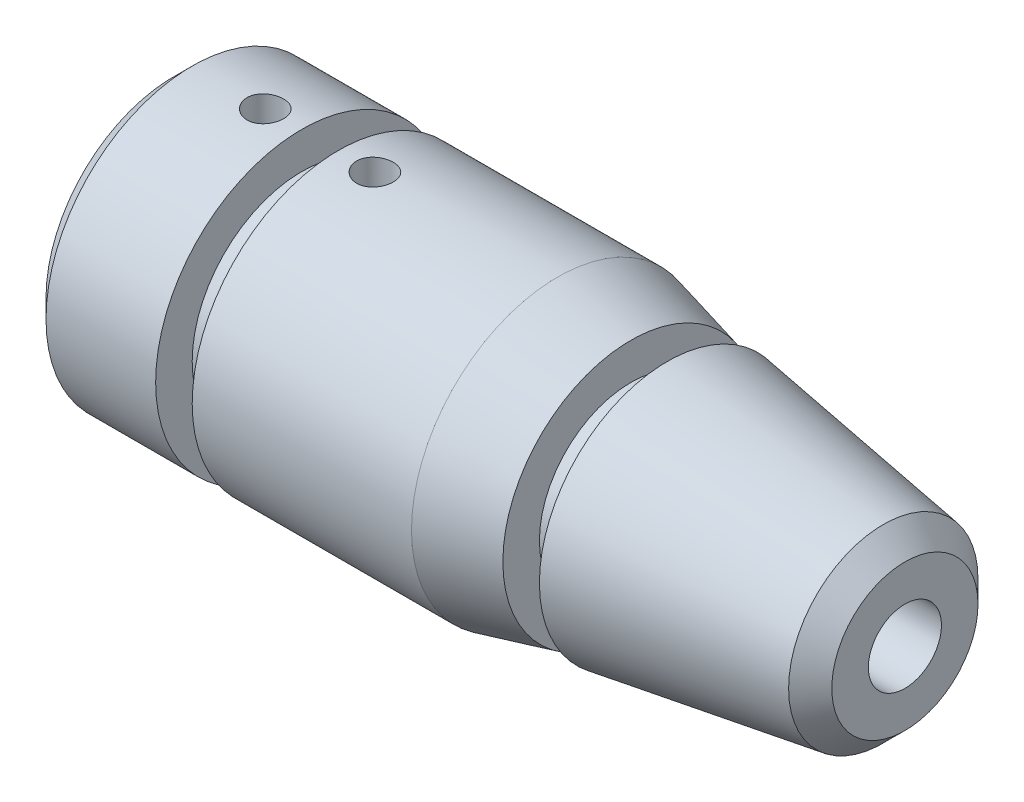
ISO-10303-21;
HEADER;
FILE_DESCRIPTION(('STEP AP214'),'2;1');
FILE_NAME('part.step','',(''),(''),'','','');
FILE_SCHEMA(('AUTOMOTIVE_DESIGN { 1 0 10303 214 1 1 1 1 }'));
ENDSEC;
DATA;
#1=APPLICATION_CONTEXT('core data for automotive mechanical design processes');
#2=APPLICATION_PROTOCOL_DEFINITION('international standard','automotive_design',2000,#1);
#3=PRODUCT_CONTEXT('',#1,'mechanical');
#4=PRODUCT('Part','Part','',(#3));
#5=PRODUCT_RELATED_PRODUCT_CATEGORY('part','',(#4));
#6=PRODUCT_DEFINITION_FORMATION('','',#4);
#7=PRODUCT_DEFINITION_CONTEXT('part definition',#1,'design');
#8=PRODUCT_DEFINITION('design','',#6,#7);
#9=PRODUCT_DEFINITION_SHAPE('','',#8);
#10=(LENGTH_UNIT() NAMED_UNIT(*) SI_UNIT(.MILLI.,.METRE.));
#11=(NAMED_UNIT(*) PLANE_ANGLE_UNIT() SI_UNIT($,.RADIAN.));
#12=(NAMED_UNIT(*) SI_UNIT($,.STERADIAN.) SOLID_ANGLE_UNIT());
#13=UNCERTAINTY_MEASURE_WITH_UNIT(LENGTH_MEASURE(1.E-05),#10,'distance_accuracy_value','');
#14=(GEOMETRIC_REPRESENTATION_CONTEXT(3) GLOBAL_UNCERTAINTY_ASSIGNED_CONTEXT((#13)) GLOBAL_UNIT_ASSIGNED_CONTEXT((#10,
#11,#12)) REPRESENTATION_CONTEXT('',''));
#15=CARTESIAN_POINT('',(0.,0.,0.));
#16=DIRECTION('',(0.,0.,1.));
#17=DIRECTION('',(1.,0.,0.));
#18=AXIS2_PLACEMENT_3D('',#15,#16,#17);
#19=CARTESIAN_POINT('',(0.,0.,0.));
#20=DIRECTION('',(-1.,0.,0.));
#21=DIRECTION('',(0.,0.,1.));
#22=AXIS2_PLACEMENT_3D('',#19,#20,#21);
#23=PLANE('',#22);
#24=CARTESIAN_POINT('',(0.,0.,0.));
#25=DIRECTION('',(-1.,0.,0.));
#26=DIRECTION('',(0.,0.,1.));
#27=AXIS2_PLACEMENT_3D('',#24,#25,#26);
#28=CIRCLE('',#27,11.1125);
#29=CARTESIAN_POINT('',(0.,0.,11.1125));
#30=VERTEX_POINT('',#29);
#31=EDGE_CURVE('E62',#30,#30,#28,.T.);
#32=ORIENTED_EDGE('',*,*,#31,.T.);
#33=EDGE_LOOP('',(#32));
#34=FACE_BOUND('',#33,.T.);
#35=CARTESIAN_POINT('',(0.,0.,0.));
#36=DIRECTION('',(-1.,0.,0.));
#37=DIRECTION('',(0.,0.,1.));
#38=AXIS2_PLACEMENT_3D('',#35,#36,#37);
#39=CIRCLE('',#38,6.35);
#40=CARTESIAN_POINT('',(0.,0.,6.35));
#41=VERTEX_POINT('',#40);
#42=EDGE_CURVE('E68',#41,#41,#39,.T.);
#43=ORIENTED_EDGE('',*,*,#42,.F.);
#44=EDGE_LOOP('',(#43));
#45=FACE_BOUND('',#44,.T.);
#46=ADVANCED_FACE('F43',(#34,#45),#23,.T.);
#47=CARTESIAN_POINT('',(0.,0.,0.));
#48=DIRECTION('',(-1.,0.,0.));
#49=DIRECTION('',(0.,0.,1.));
#50=AXIS2_PLACEMENT_3D('',#47,#48,#49);
#51=CYLINDRICAL_SURFACE('',#50,6.35);
#52=CARTESIAN_POINT('',(7.9375,6.14836106210428,1.5875));
#53=CARTESIAN_POINT('',(8.02516222683713,6.14836273554171,1.58749750990578));
#54=CARTESIAN_POINT('',(8.11285201066053,6.15025634318835,1.58021416589079));
#55=CARTESIAN_POINT('',(8.28571341214051,6.15760682365713,1.55131968466973));
#56=CARTESIAN_POINT('',(8.37088353408739,6.16306577024852,1.5297002087813));
#57=CARTESIAN_POINT('',(8.53618024674877,6.17689090118439,1.47287691176629));
#58=CARTESIAN_POINT('',(8.6163131936699,6.1852533310841,1.43769062718759));
#59=CARTESIAN_POINT('',(8.76954739136285,6.20393851938293,1.354785924701));
#60=CARTESIAN_POINT('',(8.84264834342094,6.21426136100349,1.30706697473604));
#61=CARTESIAN_POINT('',(8.9813521447415,6.23595854885813,1.19932985134304));
#62=CARTESIAN_POINT('',(9.04677743622228,6.24734969490624,1.13908642369207));
#63=CARTESIAN_POINT('',(9.16670848541882,6.26975425952214,1.00849561070392));
#64=CARTESIAN_POINT('',(9.22121322226981,6.28076764269657,0.938147281804496));
#65=CARTESIAN_POINT('',(9.31848242194586,6.30136163855569,0.788127202685138));
#66=CARTESIAN_POINT('',(9.36107245648253,6.31092011499376,0.708339055883904));
#67=CARTESIAN_POINT('',(9.43216912403721,6.32733565573,0.542457122025907));
#68=CARTESIAN_POINT('',(9.46067783496635,6.33419311857309,0.456364267477885));
#69=CARTESIAN_POINT('',(9.5022338749574,6.34431521868594,0.282167811808895));
#70=CARTESIAN_POINT('',(9.51558272414738,6.34764982591139,0.194140276913602));
#71=CARTESIAN_POINT('',(9.52738657083998,6.35059432258134,0.0170363002318606));
#72=CARTESIAN_POINT('',(9.5258437703531,6.35020476271407,-0.0720399845316717));
#73=CARTESIAN_POINT('',(9.50812497009116,6.34579690295495,-0.246621692386163));
#74=CARTESIAN_POINT('',(9.4922744335908,6.34185931486455,-0.332162492266692));
#75=CARTESIAN_POINT('',(9.44691324351921,6.33089181193282,-0.499329467769226));
#76=CARTESIAN_POINT('',(9.41740186278535,6.3238617324801,-0.580955434750569));
#77=CARTESIAN_POINT('',(9.34529336761372,6.30737568660069,-0.738833141809117));
#78=CARTESIAN_POINT('',(9.30258042663979,6.29789837506359,-0.815029659254324));
#79=CARTESIAN_POINT('',(9.20536914376118,6.27754588919127,-0.959287550465525));
#80=CARTESIAN_POINT('',(9.15086875146401,6.26667047179331,-1.02734750569824));
#81=CARTESIAN_POINT('',(9.02988494884119,6.24435958243646,-1.15534128069737));
#82=CARTESIAN_POINT('',(8.96311714335917,6.23291691898958,-1.21500531553188));
#83=CARTESIAN_POINT('',(8.82040401680194,6.21103052633109,-1.32234999684129));
#84=CARTESIAN_POINT('',(8.74445826702322,6.20058684382292,-1.37003008322305));
#85=CARTESIAN_POINT('',(8.58501582831541,6.18185515488097,-1.45222615482337));
#86=CARTESIAN_POINT('',(8.50148431125112,6.17357784665833,-1.48667718756565));
#87=CARTESIAN_POINT('',(8.32955822777145,6.16025336488873,-1.54096342276019));
#88=CARTESIAN_POINT('',(8.24116470637071,6.15520550014489,-1.56080175290274));
#89=CARTESIAN_POINT('',(8.06452571653282,6.14905651084854,-1.58485182055239));
#90=CARTESIAN_POINT('',(7.97633800123569,6.14785466574467,-1.58946245093896));
#91=CARTESIAN_POINT('',(7.80045307027287,6.1492596311046,-1.58401828897737));
#92=CARTESIAN_POINT('',(7.71275581020096,6.15186609096804,-1.57396484663399));
#93=CARTESIAN_POINT('',(7.54182244175376,6.16049747041146,-1.53982766960042));
#94=CARTESIAN_POINT('',(7.45853681862752,6.16646576098828,-1.51597618335891));
#95=CARTESIAN_POINT('',(7.29714602426418,6.18109456102061,-1.45517748186084));
#96=CARTESIAN_POINT('',(7.21904146799986,6.1897553893787,-1.41822871529747));
#97=CARTESIAN_POINT('',(7.06853978855423,6.20900547054222,-1.33144937413972));
#98=CARTESIAN_POINT('',(6.99628468657263,6.21962922065218,-1.28138031368563));
#99=CARTESIAN_POINT('',(6.86105538962114,6.2415234775054,-1.17008321503345));
#100=CARTESIAN_POINT('',(6.7980827229272,6.25279409032579,-1.10885334300364));
#101=CARTESIAN_POINT('',(6.68158998796744,6.2750535092507,-0.975142069563254));
#102=CARTESIAN_POINT('',(6.6283458602815,6.28602820809266,-0.902417474643905));
#103=CARTESIAN_POINT('',(6.53482572448596,6.30616732549721,-0.748828008777799));
#104=CARTESIAN_POINT('',(6.49454903995379,6.31533183847515,-0.667963562720178));
#105=CARTESIAN_POINT('',(6.42845676807476,6.3307602349383,-0.500948645248108));
#106=CARTESIAN_POINT('',(6.4025371794193,6.3370449206423,-0.414841342381764));
#107=CARTESIAN_POINT('',(6.36558268752365,6.34609661306326,-0.23931524450611));
#108=CARTESIAN_POINT('',(6.3545449117007,6.34886429864815,-0.149897092002977));
#109=CARTESIAN_POINT('',(6.34782895154884,6.35054243936488,0.027120098228778));
#110=CARTESIAN_POINT('',(6.35174353681107,6.34955516472013,0.114702950308575));
#111=CARTESIAN_POINT('',(6.37388842582975,6.3440611062616,0.287920900558397));
#112=CARTESIAN_POINT('',(6.3921183038333,6.33955442711888,0.373556056577155));
#113=CARTESIAN_POINT('',(6.44215789888635,6.32754374655666,0.540021519086144));
#114=CARTESIAN_POINT('',(6.47389398213696,6.32005601147983,0.620875210147366));
#115=CARTESIAN_POINT('',(6.54997829419318,6.30287171149998,0.776155821703329));
#116=CARTESIAN_POINT('',(6.59432811286293,6.29317486818656,0.850581930508267));
#117=CARTESIAN_POINT('',(6.69562293397035,6.27232758869116,0.992825561372939));
#118=CARTESIAN_POINT('',(6.75284422686546,6.26114789401158,1.06044204392718));
#119=CARTESIAN_POINT('',(6.8777212775084,6.23872655372022,1.18525134468062));
#120=CARTESIAN_POINT('',(6.94537967680542,6.22748489312182,1.24244151604575));
#121=CARTESIAN_POINT('',(7.09072974504461,6.2059736792862,1.34582221703577));
#122=CARTESIAN_POINT('',(7.16858504591754,6.19572617421192,1.3917876333714));
#123=CARTESIAN_POINT('',(7.33116309025228,6.17766029436602,1.46990894837737));
#124=CARTESIAN_POINT('',(7.41588078369445,6.16984015341641,1.50207489424355));
#125=CARTESIAN_POINT('',(7.57329100627491,6.15873655124406,1.54689576409763));
#126=CARTESIAN_POINT('',(7.64523039845938,6.15487502513368,1.56208915832016));
#127=CARTESIAN_POINT('',(7.79060682953744,6.14968668754596,1.58239188946006));
#128=CARTESIAN_POINT('',(7.86404374013903,6.14835965985317,1.58750208656584));
#129=CARTESIAN_POINT('',(7.9375,6.14836106210428,1.5875));
#130=B_SPLINE_CURVE_WITH_KNOTS('',3,(#52,#53,#54,#55,#56,#57,#58,#59,#60,#61,#62,#63,#64,#65,
#66,#67,#68,#69,#70,#71,#72,#73,#74,#75,#76,#77,#78,#79,#80,#81,#82,#83,#84,#85,#86,#87,#88,#89,
#90,#91,#92,#93,#94,#95,#96,#97,#98,#99,#100,#101,#102,#103,#104,#105,#106,#107,#108,#109,#110,
#111,#112,#113,#114,#115,#116,#117,#118,#119,#120,#121,#122,#123,#124,#125,#126,#127,#128,#129),
.UNSPECIFIED.,.T.,.F.,(4,2,2,2,2,2,2,2,2,2,2,2,2,2,2,2,2,2,2,2,2,2,2,2,2,2,2,2,2,2,2,2,2,2,2,2,
2,2,4),(0.,0.262716925502447,0.525586795807202,0.788118011750423,1.05066037489729,
1.3184121091254,1.58618886139715,1.85770200212679,2.12917506502903,2.39514856882045,
2.66108274402923,2.92111596807481,3.18116303520239,3.44355975151572,3.7060021477276,
3.97554746273164,4.24510537311874,4.51597034325336,4.78677732082263,5.0504316997369,
5.31406180761714,5.57337852180846,5.832725961026,6.09716107120565,6.36163966992003,
6.63273585162977,6.90381788981916,7.172909662324,7.44194948557239,7.70371488290935,
7.96547249534383,8.22582096615416,8.48620226643676,8.75282156329615,9.01950845044098,
9.2911706307577,9.56263468067804,9.78279620257604,10.002938941882),.UNSPECIFIED.);
#131=CARTESIAN_POINT('',(7.9375,6.14836106210428,1.5875));
#132=VERTEX_POINT('',#131);
#133=EDGE_CURVE('E120',#132,#132,#130,.T.);
#134=ORIENTED_EDGE('',*,*,#133,.T.);
#135=EDGE_LOOP('',(#134));
#136=FACE_BOUND('',#135,.T.);
#137=CARTESIAN_POINT('',(17.4625,6.14836106210428,1.5875));
#138=CARTESIAN_POINT('',(17.5501622268371,6.14836273554171,1.58749750990578));
#139=CARTESIAN_POINT('',(17.6378520106605,6.15025634318835,1.58021416589079));
#140=CARTESIAN_POINT('',(17.8107134121405,6.15760682365713,1.55131968466973));
#141=CARTESIAN_POINT('',(17.8958835340874,6.16306577024852,1.52970020878129));
#142=CARTESIAN_POINT('',(18.0611802467488,6.17689090118439,1.47287691176629));
#143=CARTESIAN_POINT('',(18.1413131936699,6.1852533310841,1.43769062718759));
#144=CARTESIAN_POINT('',(18.2945473913628,6.20393851938293,1.354785924701));
#145=CARTESIAN_POINT('',(18.3676483434209,6.21426136100349,1.30706697473604));
#146=CARTESIAN_POINT('',(18.5063521447415,6.23595854885813,1.19932985134304));
#147=CARTESIAN_POINT('',(18.5717774362223,6.24734969490624,1.13908642369207));
#148=CARTESIAN_POINT('',(18.6917084854188,6.26975425952214,1.00849561070392));
#149=CARTESIAN_POINT('',(18.7462132222698,6.28076764269657,0.938147281804495));
#150=CARTESIAN_POINT('',(18.8434824219459,6.30136163855569,0.788127202685135));
#151=CARTESIAN_POINT('',(18.8860724564825,6.31092011499376,0.708339055883901));
#152=CARTESIAN_POINT('',(18.9571691240372,6.32733565573,0.542457122025904));
#153=CARTESIAN_POINT('',(18.9856778349663,6.33419311857309,0.456364267477882));
#154=CARTESIAN_POINT('',(19.0272338749574,6.34431521868594,0.282167811808892));
#155=CARTESIAN_POINT('',(19.0405827241474,6.34764982591139,0.194140276913599));
#156=CARTESIAN_POINT('',(19.05238657084,6.35059432258134,0.017036300231859));
#157=CARTESIAN_POINT('',(19.0508437703531,6.35020476271407,-0.0720399845316728));
#158=CARTESIAN_POINT('',(19.0331249700912,6.34579690295495,-0.246621692386164));
#159=CARTESIAN_POINT('',(19.0172744335908,6.34185931486455,-0.332162492266693));
#160=CARTESIAN_POINT('',(18.9719132435192,6.33089181193282,-0.499329467769226));
#161=CARTESIAN_POINT('',(18.9424018627853,6.3238617324801,-0.58095543475057));
#162=CARTESIAN_POINT('',(18.8702933676137,6.30737568660069,-0.738833141809117));
#163=CARTESIAN_POINT('',(18.8275804266398,6.29789837506359,-0.815029659254324));
#164=CARTESIAN_POINT('',(18.7303691437612,6.27754588919127,-0.959287550465524));
#165=CARTESIAN_POINT('',(18.675868751464,6.26667047179331,-1.02734750569824));
#166=CARTESIAN_POINT('',(18.5548849488412,6.24435958243646,-1.15534128069736));
#167=CARTESIAN_POINT('',(18.4881171433592,6.23291691898958,-1.21500531553187));
#168=CARTESIAN_POINT('',(18.3454040168019,6.21103052633109,-1.32234999684129));
#169=CARTESIAN_POINT('',(18.2694582670232,6.20058684382292,-1.37003008322305));
#170=CARTESIAN_POINT('',(18.1100158283154,6.18185515488097,-1.45222615482337));
#171=CARTESIAN_POINT('',(18.0264843112511,6.17357784665833,-1.48667718756565));
#172=CARTESIAN_POINT('',(17.8545582277715,6.16025336488873,-1.54096342276019));
#173=CARTESIAN_POINT('',(17.7661647063707,6.15520550014489,-1.56080175290274));
#174=CARTESIAN_POINT('',(17.5895257165328,6.14905651084854,-1.58485182055239));
#175=CARTESIAN_POINT('',(17.5013380012357,6.14785466574467,-1.58946245093896));
#176=CARTESIAN_POINT('',(17.3254530702729,6.1492596311046,-1.58401828897737));
#177=CARTESIAN_POINT('',(17.237755810201,6.15186609096804,-1.57396484663399));
#178=CARTESIAN_POINT('',(17.0668224417538,6.16049747041146,-1.53982766960041));
#179=CARTESIAN_POINT('',(16.9835368186275,6.16646576098828,-1.51597618335891));
#180=CARTESIAN_POINT('',(16.8221460242642,6.18109456102061,-1.45517748186084));
#181=CARTESIAN_POINT('',(16.7440414679999,6.1897553893787,-1.41822871529747));
#182=CARTESIAN_POINT('',(16.5935397885542,6.20900547054222,-1.33144937413971));
#183=CARTESIAN_POINT('',(16.5212846865726,6.21962922065218,-1.28138031368562));
#184=CARTESIAN_POINT('',(16.3860553896211,6.2415234775054,-1.17008321503345));
#185=CARTESIAN_POINT('',(16.3230827229272,6.25279409032579,-1.10885334300363));
#186=CARTESIAN_POINT('',(16.2065899879674,6.2750535092507,-0.975142069563251));
#187=CARTESIAN_POINT('',(16.1533458602815,6.28602820809266,-0.902417474643903));
#188=CARTESIAN_POINT('',(16.059825724486,6.30616732549721,-0.748828008777798));
#189=CARTESIAN_POINT('',(16.0195490399538,6.31533183847515,-0.667963562720177));
#190=CARTESIAN_POINT('',(15.9534567680748,6.3307602349383,-0.500948645248107));
#191=CARTESIAN_POINT('',(15.9275371794193,6.3370449206423,-0.414841342381763));
#192=CARTESIAN_POINT('',(15.8905826875237,6.34609661306326,-0.239315244506109));
#193=CARTESIAN_POINT('',(15.8795449117007,6.34886429864815,-0.149897092002975));
#194=CARTESIAN_POINT('',(15.8728289515488,6.35054243936488,0.0271200982287798));
#195=CARTESIAN_POINT('',(15.8767435368111,6.34955516472013,0.114702950308576));
#196=CARTESIAN_POINT('',(15.8988884258298,6.3440611062616,0.287920900558397));
#197=CARTESIAN_POINT('',(15.9171183038333,6.33955442711888,0.373556056577156));
#198=CARTESIAN_POINT('',(15.9671578988863,6.32754374655666,0.540021519086144));
#199=CARTESIAN_POINT('',(15.998893982137,6.32005601147983,0.620875210147365));
#200=CARTESIAN_POINT('',(16.0749782941932,6.30287171149998,0.776155821703329));
#201=CARTESIAN_POINT('',(16.1193281128629,6.29317486818656,0.850581930508267));
#202=CARTESIAN_POINT('',(16.2206229339704,6.27232758869116,0.992825561372938));
#203=CARTESIAN_POINT('',(16.2778442268655,6.26114789401158,1.06044204392718));
#204=CARTESIAN_POINT('',(16.4027212775084,6.23872655372022,1.18525134468062));
#205=CARTESIAN_POINT('',(16.4703796768054,6.22748489312182,1.24244151604575));
#206=CARTESIAN_POINT('',(16.6157297450446,6.2059736792862,1.34582221703577));
#207=CARTESIAN_POINT('',(16.6935850459175,6.19572617421192,1.39178763337139));
#208=CARTESIAN_POINT('',(16.8561630902523,6.17766029436603,1.46990894837737));
#209=CARTESIAN_POINT('',(16.9408807836944,6.16984015341641,1.50207489424355));
#210=CARTESIAN_POINT('',(17.0982910062749,6.15873655124406,1.54689576409763));
#211=CARTESIAN_POINT('',(17.1702303984594,6.15487502513368,1.56208915832016));
#212=CARTESIAN_POINT('',(17.3156068295374,6.14968668754596,1.58239188946006));
#213=CARTESIAN_POINT('',(17.389043740139,6.14835965985317,1.58750208656584));
#214=CARTESIAN_POINT('',(17.4625,6.14836106210428,1.5875));
#215=B_SPLINE_CURVE_WITH_KNOTS('',3,(#137,#138,#139,#140,#141,#142,#143,#144,#145,#146,#147,
#148,#149,#150,#151,#152,#153,#154,#155,#156,#157,#158,#159,#160,#161,#162,#163,#164,#165,#166,
#167,#168,#169,#170,#171,#172,#173,#174,#175,#176,#177,#178,#179,#180,#181,#182,#183,#184,#185,
#186,#187,#188,#189,#190,#191,#192,#193,#194,#195,#196,#197,#198,#199,#200,#201,#202,#203,#204,
#205,#206,#207,#208,#209,#210,#211,#212,#213,#214),.UNSPECIFIED.,.T.,.F.,(4,2,2,2,2,2,2,2,2,2,2,
2,2,2,2,2,2,2,2,2,2,2,2,2,2,2,2,2,2,2,2,2,2,2,2,2,2,2,4),(0.,0.262716925502447,
0.525586795807202,0.788118011750419,1.05066037489729,1.3184121091254,1.58618886139715,
1.85770200212679,2.12917506502903,2.39514856882045,2.66108274402923,2.92111596807481,
3.18116303520239,3.44355975151572,3.70600214772759,3.97554746273163,4.24510537311874,
4.51597034325335,4.78677732082262,5.0504316997369,5.31406180761714,5.57337852180846,
5.832725961026,6.09716107120564,6.36163966992003,6.63273585162977,6.90381788981916,
7.17290966232399,7.44194948557239,7.70371488290934,7.96547249534382,8.22582096615415,
8.48620226643675,8.75282156329614,9.01950845044097,9.29117063075769,9.56263468067803,
9.78279620257604,10.0029389418819),.UNSPECIFIED.);
#216=CARTESIAN_POINT('',(17.4625,6.14836106210428,1.5875));
#217=VERTEX_POINT('',#216);
#218=EDGE_CURVE('E131',#217,#217,#215,.T.);
#219=ORIENTED_EDGE('',*,*,#218,.T.);
#220=EDGE_LOOP('',(#219));
#221=FACE_BOUND('',#220,.T.);
#222=ORIENTED_EDGE('',*,*,#42,.T.);
#223=EDGE_LOOP('',(#222));
#224=FACE_BOUND('',#223,.T.);
#225=CARTESIAN_POINT('',(20.6375,0.,0.));
#226=DIRECTION('',(-1.,0.,0.));
#227=DIRECTION('',(0.,0.,1.));
#228=AXIS2_PLACEMENT_3D('',#225,#226,#227);
#229=CIRCLE('',#228,6.35);
#230=CARTESIAN_POINT('',(20.6375,0.,6.35));
#231=VERTEX_POINT('',#230);
#232=EDGE_CURVE('E72',#231,#231,#229,.T.);
#233=ORIENTED_EDGE('',*,*,#232,.F.);
#234=EDGE_LOOP('',(#233));
#235=FACE_BOUND('',#234,.T.);
#236=ADVANCED_FACE('F193',(#136,#221,#224,#235),#51,.F.);
#237=CARTESIAN_POINT('',(25.4,0.,0.));
#238=DIRECTION('',(-1.,0.,0.));
#239=DIRECTION('',(0.,0.,1.));
#240=AXIS2_PLACEMENT_3D('',#237,#238,#239);
#241=CONICAL_SURFACE('',#240,3.17499999999999,0.588002603547569);
#242=ORIENTED_EDGE('',*,*,#232,.T.);
#243=EDGE_LOOP('',(#242));
#244=FACE_BOUND('',#243,.T.);
#245=CARTESIAN_POINT('',(25.4,0.,0.));
#246=DIRECTION('',(-1.,0.,0.));
#247=DIRECTION('',(0.,0.,1.));
#248=AXIS2_PLACEMENT_3D('',#245,#246,#247);
#249=CIRCLE('',#248,3.17499999999999);
#250=CARTESIAN_POINT('',(25.4,0.,3.17499999999999));
#251=VERTEX_POINT('',#250);
#252=EDGE_CURVE('E76',#251,#251,#249,.T.);
#253=ORIENTED_EDGE('',*,*,#252,.F.);
#254=EDGE_LOOP('',(#253));
#255=FACE_BOUND('',#254,.T.);
#256=ADVANCED_FACE('F189',(#244,#255),#241,.F.);
#257=CARTESIAN_POINT('',(0.,0.,0.));
#258=DIRECTION('',(-1.,0.,0.));
#259=DIRECTION('',(0.,0.,1.));
#260=AXIS2_PLACEMENT_3D('',#257,#258,#259);
#261=CYLINDRICAL_SURFACE('',#260,3.17499999999999);
#262=ORIENTED_EDGE('',*,*,#252,.T.);
#263=EDGE_LOOP('',(#262));
#264=FACE_BOUND('',#263,.T.);
#265=CARTESIAN_POINT('',(63.5,0.,0.));
#266=DIRECTION('',(-1.,0.,0.));
#267=DIRECTION('',(0.,0.,1.));
#268=AXIS2_PLACEMENT_3D('',#265,#266,#267);
#269=CIRCLE('',#268,3.175);
#270=CARTESIAN_POINT('',(63.5,0.,3.175));
#271=VERTEX_POINT('',#270);
#272=EDGE_CURVE('E80',#271,#271,#269,.T.);
#273=ORIENTED_EDGE('',*,*,#272,.F.);
#274=EDGE_LOOP('',(#273));
#275=FACE_BOUND('',#274,.T.);
#276=ADVANCED_FACE('F186',(#264,#275),#261,.F.);
#277=CARTESIAN_POINT('',(63.5,0.,0.));
#278=DIRECTION('',(1.,0.,0.));
#279=DIRECTION('',(0.,0.,-1.));
#280=AXIS2_PLACEMENT_3D('',#277,#278,#279);
#281=PLANE('',#280);
#282=CARTESIAN_POINT('',(63.5,0.,0.));
#283=DIRECTION('',(1.,0.,0.));
#284=DIRECTION('',(0.,0.,-1.));
#285=AXIS2_PLACEMENT_3D('',#282,#283,#284);
#286=CIRCLE('',#285,6.35000000000003);
#287=CARTESIAN_POINT('',(63.5,0.,-6.35000000000003));
#288=VERTEX_POINT('',#287);
#289=EDGE_CURVE('E10',#288,#288,#286,.T.);
#290=ORIENTED_EDGE('',*,*,#289,.T.);
#291=EDGE_LOOP('',(#290));
#292=FACE_BOUND('',#291,.T.);
#293=ORIENTED_EDGE('',*,*,#272,.T.);
#294=EDGE_LOOP('',(#293));
#295=FACE_BOUND('',#294,.T.);
#296=ADVANCED_FACE('F183',(#292,#295),#281,.T.);
#297=CARTESIAN_POINT('',(42.8625,0.,0.));
#298=DIRECTION('',(-1.,0.,0.));
#299=DIRECTION('',(0.,0.,1.));
#300=AXIS2_PLACEMENT_3D('',#297,#298,#299);
#301=CONICAL_SURFACE('',#300,11.1125,0.152649328395265);
#302=CARTESIAN_POINT('',(61.6238636363637,0.,0.));
#303=DIRECTION('',(1.,0.,0.));
#304=DIRECTION('',(0.,0.,-1.));
#305=AXIS2_PLACEMENT_3D('',#302,#303,#304);
#306=CIRCLE('',#305,8.22613636363636);
#307=CARTESIAN_POINT('',(61.6238636363637,0.,-8.22613636363636));
#308=VERTEX_POINT('',#307);
#309=EDGE_CURVE('E52',#308,#308,#306,.F.);
#310=ORIENTED_EDGE('',*,*,#309,.T.);
#311=EDGE_LOOP('',(#310));
#312=FACE_BOUND('',#311,.T.);
#313=CARTESIAN_POINT('',(42.8625,0.,0.));
#314=DIRECTION('',(-1.,0.,0.));
#315=DIRECTION('',(0.,0.,1.));
#316=AXIS2_PLACEMENT_3D('',#313,#314,#315);
#317=CIRCLE('',#316,11.1125);
#318=CARTESIAN_POINT('',(42.8625,0.,11.1125));
#319=VERTEX_POINT('',#318);
#320=EDGE_CURVE('E84',#319,#319,#317,.T.);
#321=ORIENTED_EDGE('',*,*,#320,.F.);
#322=EDGE_LOOP('',(#321));
#323=FACE_BOUND('',#322,.T.);
#324=ADVANCED_FACE('F179',(#312,#323),#301,.T.);
#325=CARTESIAN_POINT('',(42.8625,0.,0.));
#326=DIRECTION('',(-1.,0.,0.));
#327=DIRECTION('',(0.,0.,1.));
#328=AXIS2_PLACEMENT_3D('',#325,#326,#327);
#329=PLANE('',#328);
#330=ORIENTED_EDGE('',*,*,#320,.T.);
#331=EDGE_LOOP('',(#330));
#332=FACE_BOUND('',#331,.T.);
#333=CARTESIAN_POINT('',(42.8625,0.,0.));
#334=DIRECTION('',(-1.,0.,0.));
#335=DIRECTION('',(0.,0.,1.));
#336=AXIS2_PLACEMENT_3D('',#333,#334,#335);
#337=CIRCLE('',#336,7.93750000000001);
#338=CARTESIAN_POINT('',(42.8625,0.,7.93750000000001));
#339=VERTEX_POINT('',#338);
#340=EDGE_CURVE('E88',#339,#339,#337,.T.);
#341=ORIENTED_EDGE('',*,*,#340,.F.);
#342=EDGE_LOOP('',(#341));
#343=FACE_BOUND('',#342,.T.);
#344=ADVANCED_FACE('F175',(#332,#343),#329,.T.);
#345=CARTESIAN_POINT('',(0.,0.,0.));
#346=DIRECTION('',(-1.,0.,0.));
#347=DIRECTION('',(0.,0.,1.));
#348=AXIS2_PLACEMENT_3D('',#345,#346,#347);
#349=CYLINDRICAL_SURFACE('',#348,7.9375);
#350=ORIENTED_EDGE('',*,*,#340,.T.);
#351=EDGE_LOOP('',(#350));
#352=FACE_BOUND('',#351,.T.);
#353=CARTESIAN_POINT('',(39.6875,0.,0.));
#354=DIRECTION('',(-1.,0.,0.));
#355=DIRECTION('',(0.,0.,1.));
#356=AXIS2_PLACEMENT_3D('',#353,#354,#355);
#357=CIRCLE('',#356,7.9375);
#358=CARTESIAN_POINT('',(39.6875,0.,7.9375));
#359=VERTEX_POINT('',#358);
#360=EDGE_CURVE('E92',#359,#359,#357,.T.);
#361=ORIENTED_EDGE('',*,*,#360,.F.);
#362=EDGE_LOOP('',(#361));
#363=FACE_BOUND('',#362,.T.);
#364=ADVANCED_FACE('F171',(#352,#363),#349,.T.);
#365=CARTESIAN_POINT('',(39.6875,0.,0.));
#366=DIRECTION('',(1.,0.,0.));
#367=DIRECTION('',(0.,0.,-1.));
#368=AXIS2_PLACEMENT_3D('',#365,#366,#367);
#369=PLANE('',#368);
#370=ORIENTED_EDGE('',*,*,#360,.T.);
#371=EDGE_LOOP('',(#370));
#372=FACE_BOUND('',#371,.T.);
#373=CARTESIAN_POINT('',(39.6875,0.,0.));
#374=DIRECTION('',(-1.,0.,0.));
#375=DIRECTION('',(0.,0.,1.));
#376=AXIS2_PLACEMENT_3D('',#373,#374,#375);
#377=CIRCLE('',#376,11.1125);
#378=CARTESIAN_POINT('',(39.6875,0.,11.1125));
#379=VERTEX_POINT('',#378);
#380=EDGE_CURVE('E96',#379,#379,#377,.T.);
#381=ORIENTED_EDGE('',*,*,#380,.F.);
#382=EDGE_LOOP('',(#381));
#383=FACE_BOUND('',#382,.T.);
#384=ADVANCED_FACE('F167',(#372,#383),#369,.T.);
#385=CARTESIAN_POINT('',(33.3375,0.,0.));
#386=DIRECTION('',(-1.,0.,0.));
#387=DIRECTION('',(0.,0.,1.));
#388=AXIS2_PLACEMENT_3D('',#385,#386,#387);
#389=CONICAL_SURFACE('',#388,12.7,0.244978663126863);
#390=ORIENTED_EDGE('',*,*,#380,.T.);
#391=EDGE_LOOP('',(#390));
#392=FACE_BOUND('',#391,.T.);
#393=CARTESIAN_POINT('',(33.3375,0.,0.));
#394=DIRECTION('',(-1.,0.,0.));
#395=DIRECTION('',(0.,0.,1.));
#396=AXIS2_PLACEMENT_3D('',#393,#394,#395);
#397=CIRCLE('',#396,12.7);
#398=CARTESIAN_POINT('',(33.3375,0.,12.7));
#399=VERTEX_POINT('',#398);
#400=EDGE_CURVE('E100',#399,#399,#397,.T.);
#401=ORIENTED_EDGE('',*,*,#400,.F.);
#402=EDGE_LOOP('',(#401));
#403=FACE_BOUND('',#402,.T.);
#404=ADVANCED_FACE('F163',(#392,#403),#389,.T.);
#405=CARTESIAN_POINT('',(0.,0.,0.));
#406=DIRECTION('',(-1.,0.,0.));
#407=DIRECTION('',(0.,0.,1.));
#408=AXIS2_PLACEMENT_3D('',#405,#406,#407);
#409=CYLINDRICAL_SURFACE('',#408,12.7);
#410=CARTESIAN_POINT('',(17.4625,12.6003906189451,1.5875));
#411=CARTESIAN_POINT('',(17.3737039597922,12.6003918944879,1.58749622481956));
#412=CARTESIAN_POINT('',(17.2848524222854,12.6013393840053,1.58002471587852));
#413=CARTESIAN_POINT('',(17.1096221018681,12.6050255327228,1.55033752271305));
#414=CARTESIAN_POINT('',(17.0232460013844,12.6077660635828,1.52810643139297));
#415=CARTESIAN_POINT('',(16.8555289748563,12.614723143474,1.46956569994448));
#416=CARTESIAN_POINT('',(16.7741846747546,12.6189386905307,1.43326561504688));
#417=CARTESIAN_POINT('',(16.6187574330923,12.6283696093514,1.34763776600275));
#418=CARTESIAN_POINT('',(16.5446732531432,12.6335848101502,1.29831222898299));
#419=CARTESIAN_POINT('',(16.4054394730774,12.6444601011988,1.1877379409179));
#420=CARTESIAN_POINT('',(16.3403363805275,12.650122284808,1.12643082754043));
#421=CARTESIAN_POINT('',(16.2213145417237,12.6612347287615,0.993759290526228));
#422=CARTESIAN_POINT('',(16.1673963518999,12.6666849785516,0.92239436682685));
#423=CARTESIAN_POINT('',(16.0721080770135,12.6767808732914,0.771340742479241));
#424=CARTESIAN_POINT('',(16.0307800763617,12.6814237979272,0.691625296681306));
#425=CARTESIAN_POINT('',(15.9621148880375,12.6893589046612,0.526317665965506));
#426=CARTESIAN_POINT('',(15.9347771811017,12.6926511368908,0.440725699294174));
#427=CARTESIAN_POINT('',(15.8950075366076,12.6974991712846,0.266570261721956));
#428=CARTESIAN_POINT('',(15.8824982841373,12.6990639772082,0.178024700886245));
#429=CARTESIAN_POINT('',(15.8725010305018,12.7003115927805,7.82324359569511E-05));
#430=CARTESIAN_POINT('',(15.8750124384101,12.6999944764657,-0.0893226413916798));
#431=CARTESIAN_POINT('',(15.894923253751,12.6975212633396,-0.265915945798838));
#432=CARTESIAN_POINT('',(15.9122395105357,12.6953754375939,-0.353117915660428));
#433=CARTESIAN_POINT('',(15.96113849716,12.6894974552338,-0.523368374079914));
#434=CARTESIAN_POINT('',(15.9927214982159,12.6857652684622,-0.606416783643691));
#435=CARTESIAN_POINT('',(16.0693458729177,12.6771162370803,-0.766260097803536));
#436=CARTESIAN_POINT('',(16.1144232306587,12.6721962319046,-0.843037574678729));
#437=CARTESIAN_POINT('',(16.2167305600072,12.6617220035645,-0.987969482214612));
#438=CARTESIAN_POINT('',(16.2739610889625,12.6561677513189,-1.05612351717302));
#439=CARTESIAN_POINT('',(16.39941590481,12.6450018087743,-1.18236239954082));
#440=CARTESIAN_POINT('',(16.4677126573121,12.63938998536,-1.24037524339746));
#441=CARTESIAN_POINT('',(16.6131122885569,12.6287788568227,-1.34412536014694));
#442=CARTESIAN_POINT('',(16.6902151949017,12.6237795536196,-1.38986259456129));
#443=CARTESIAN_POINT('',(16.8511026296821,12.6149595465908,-1.46776730422504));
#444=CARTESIAN_POINT('',(16.9348899807703,12.6111393440166,-1.49992901046258));
#445=CARTESIAN_POINT('',(17.1067345529895,12.6051198398493,-1.54970585058723));
#446=CARTESIAN_POINT('',(17.194791568126,12.6029204601406,-1.56732168551776));
#447=CARTESIAN_POINT('',(17.3720399205698,12.6004058937787,-1.58741137426197));
#448=CARTESIAN_POINT('',(17.4612196006614,12.6000780982591,-1.58998655966891));
#449=CARTESIAN_POINT('',(17.6387391253375,12.6013104661098,-1.5801892153014));
#450=CARTESIAN_POINT('',(17.7270789877824,12.6028705892392,-1.56781700412973));
#451=CARTESIAN_POINT('',(17.9001075598719,12.6076915008733,-1.52856138648156));
#452=CARTESIAN_POINT('',(17.9848075756459,12.6109465376111,-1.50172704717875));
#453=CARTESIAN_POINT('',(18.1485058383318,12.6187858493146,-1.43435941163874));
#454=CARTESIAN_POINT('',(18.227503884798,12.6233701709813,-1.39382563409908));
#455=CARTESIAN_POINT('',(18.3780141988212,12.633381714093,-1.29996058406837));
#456=CARTESIAN_POINT('',(18.4494847324747,12.6388132588805,-1.24656286093146));
#457=CARTESIAN_POINT('',(18.5824854117487,12.649893671149,-1.12857962140429));
#458=CARTESIAN_POINT('',(18.6440151705362,12.6555425470767,-1.06399366984018));
#459=CARTESIAN_POINT('',(18.7557436589573,12.6664598631622,-0.925024677479663));
#460=CARTESIAN_POINT('',(18.8058758037148,12.6717259513445,-0.850587892494317));
#461=CARTESIAN_POINT('',(18.8929252681975,12.6812491677507,-0.694291589367936));
#462=CARTESIAN_POINT('',(18.9298428542854,12.685506316311,-0.612432220883884));
#463=CARTESIAN_POINT('',(18.9893052946866,12.6925215456477,-0.443835700553553));
#464=CARTESIAN_POINT('',(19.0118886309801,12.6952836371169,-0.357112294734978));
#465=CARTESIAN_POINT('',(19.042166696659,12.6990141922025,-0.181067746371504));
#466=CARTESIAN_POINT('',(19.0498620974305,12.6999827367006,-0.0917467211531973));
#467=CARTESIAN_POINT('',(19.0501333006555,12.7000166878868,0.0863074114233029));
#468=CARTESIAN_POINT('',(19.0428117749607,12.6990950181158,0.175040377448856));
#469=CARTESIAN_POINT('',(19.0134744104714,12.6954777913529,0.350004215822409));
#470=CARTESIAN_POINT('',(18.9914585818965,12.6927822355947,0.436235089910504));
#471=CARTESIAN_POINT('',(18.9333897973879,12.6859187810964,0.603733516296945));
#472=CARTESIAN_POINT('',(18.897341758598,12.6817513981589,0.685002795701328));
#473=CARTESIAN_POINT('',(18.8122424652242,12.6724057422999,0.840354769086455));
#474=CARTESIAN_POINT('',(18.7631910560538,12.6672274573608,0.914437377616399));
#475=CARTESIAN_POINT('',(18.6530975582614,12.6563957814274,1.05383759765622));
#476=CARTESIAN_POINT('',(18.5919790761125,12.6507395021211,1.11909465527478));
#477=CARTESIAN_POINT('',(18.4596449805417,12.639612509736,1.23846661045028));
#478=CARTESIAN_POINT('',(18.3884269787933,12.6341418409304,1.29257886504887));
#479=CARTESIAN_POINT('',(18.2376000990872,12.6239829523563,1.38830382899768));
#480=CARTESIAN_POINT('',(18.1579598803912,12.619297835727,1.42986746231088));
#481=CARTESIAN_POINT('',(17.9928159697223,12.6112768990596,1.49897165809803));
#482=CARTESIAN_POINT('',(17.9073187704423,12.6079396123271,1.52652747222998));
#483=CARTESIAN_POINT('',(17.7615659582274,12.603802496306,1.56023684411111));
#484=CARTESIAN_POINT('',(17.7022296757736,12.6025294146641,1.57044582469172));
#485=CARTESIAN_POINT('',(17.582770746271,12.6008230471599,1.5840786555));
#486=CARTESIAN_POINT('',(17.5226481051919,12.6003897549259,1.58750255720807));
#487=CARTESIAN_POINT('',(17.4625,12.6003906189451,1.5875));
#488=B_SPLINE_CURVE_WITH_KNOTS('',3,(#410,#411,#412,#413,#414,#415,#416,#417,#418,#419,#420,
#421,#422,#423,#424,#425,#426,#427,#428,#429,#430,#431,#432,#433,#434,#435,#436,#437,#438,#439,
#440,#441,#442,#443,#444,#445,#446,#447,#448,#449,#450,#451,#452,#453,#454,#455,#456,#457,#458,
#459,#460,#461,#462,#463,#464,#465,#466,#467,#468,#469,#470,#471,#472,#473,#474,#475,#476,#477,
#478,#479,#480,#481,#482,#483,#484,#485,#486,#487),.UNSPECIFIED.,.T.,.F.,(4,2,2,2,2,2,2,2,2,2,2,
2,2,2,2,2,2,2,2,2,2,2,2,2,2,2,2,2,2,2,2,2,2,2,2,2,2,2,4),(0.,0.266168389099321,
0.532615061356762,0.798881087389068,1.06510161598639,1.33265276743657,1.60021722591538,
1.86866648202545,2.13710577365792,2.40413919057825,2.67116210223019,2.93669507232479,
3.20223309051586,3.4684855980213,3.73475031857881,4.00283487834884,4.27092027843335,
4.5391194887927,4.8073057724418,5.07368313306735,5.34005481597718,5.60552838945885,
5.87101129079526,6.1378961541051,6.40479140041704,6.67320792541637,6.94161903970137,
7.20930649058437,7.47698186955735,7.74283323343041,8.0086844124111,8.27444251600497,
8.54020377912297,8.80770481845681,9.07526922204291,9.3438668704257,9.6121714409858,
9.79246828416922,9.97276375938226),.UNSPECIFIED.);
#489=CARTESIAN_POINT('',(17.4625,12.6003906189451,1.5875));
#490=VERTEX_POINT('',#489);
#491=EDGE_CURVE('E121',#490,#490,#488,.T.);
#492=ORIENTED_EDGE('',*,*,#491,.T.);
#493=EDGE_LOOP('',(#492));
#494=FACE_BOUND('',#493,.T.);
#495=ORIENTED_EDGE('',*,*,#400,.T.);
#496=EDGE_LOOP('',(#495));
#497=FACE_BOUND('',#496,.T.);
#498=CARTESIAN_POINT('',(14.2875,0.,0.));
#499=DIRECTION('',(-1.,0.,0.));
#500=DIRECTION('',(0.,0.,1.));
#501=AXIS2_PLACEMENT_3D('',#498,#499,#500);
#502=CIRCLE('',#501,12.7);
#503=CARTESIAN_POINT('',(14.2875,0.,12.7));
#504=VERTEX_POINT('',#503);
#505=EDGE_CURVE('E104',#504,#504,#502,.T.);
#506=ORIENTED_EDGE('',*,*,#505,.F.);
#507=EDGE_LOOP('',(#506));
#508=FACE_BOUND('',#507,.T.);
#509=ADVANCED_FACE('F159',(#494,#497,#508),#409,.T.);
#510=CARTESIAN_POINT('',(14.2875,0.,0.));
#511=DIRECTION('',(-1.,0.,0.));
#512=DIRECTION('',(0.,0.,1.));
#513=AXIS2_PLACEMENT_3D('',#510,#511,#512);
#514=PLANE('',#513);
#515=ORIENTED_EDGE('',*,*,#505,.T.);
#516=EDGE_LOOP('',(#515));
#517=FACE_BOUND('',#516,.T.);
#518=CARTESIAN_POINT('',(14.2875,0.,0.));
#519=DIRECTION('',(-1.,0.,0.));
#520=DIRECTION('',(0.,0.,1.));
#521=AXIS2_PLACEMENT_3D('',#518,#519,#520);
#522=CIRCLE('',#521,9.525);
#523=CARTESIAN_POINT('',(14.2875,0.,9.525));
#524=VERTEX_POINT('',#523);
#525=EDGE_CURVE('E108',#524,#524,#522,.T.);
#526=ORIENTED_EDGE('',*,*,#525,.F.);
#527=EDGE_LOOP('',(#526));
#528=FACE_BOUND('',#527,.T.);
#529=ADVANCED_FACE('F155',(#517,#528),#514,.T.);
#530=CARTESIAN_POINT('',(0.,0.,0.));
#531=DIRECTION('',(-1.,0.,0.));
#532=DIRECTION('',(0.,0.,1.));
#533=AXIS2_PLACEMENT_3D('',#530,#531,#532);
#534=CYLINDRICAL_SURFACE('',#533,9.525);
#535=ORIENTED_EDGE('',*,*,#525,.T.);
#536=EDGE_LOOP('',(#535));
#537=FACE_BOUND('',#536,.T.);
#538=CARTESIAN_POINT('',(11.1125,0.,0.));
#539=DIRECTION('',(-1.,0.,0.));
#540=DIRECTION('',(0.,0.,1.));
#541=AXIS2_PLACEMENT_3D('',#538,#539,#540);
#542=CIRCLE('',#541,9.525);
#543=CARTESIAN_POINT('',(11.1125,0.,9.525));
#544=VERTEX_POINT('',#543);
#545=EDGE_CURVE('E112',#544,#544,#542,.T.);
#546=ORIENTED_EDGE('',*,*,#545,.F.);
#547=EDGE_LOOP('',(#546));
#548=FACE_BOUND('',#547,.T.);
#549=ADVANCED_FACE('F151',(#537,#548),#534,.T.);
#550=CARTESIAN_POINT('',(11.1125,0.,0.));
#551=DIRECTION('',(1.,0.,0.));
#552=DIRECTION('',(0.,0.,-1.));
#553=AXIS2_PLACEMENT_3D('',#550,#551,#552);
#554=PLANE('',#553);
#555=ORIENTED_EDGE('',*,*,#545,.T.);
#556=EDGE_LOOP('',(#555));
#557=FACE_BOUND('',#556,.T.);
#558=CARTESIAN_POINT('',(11.1125,0.,0.));
#559=DIRECTION('',(-1.,0.,0.));
#560=DIRECTION('',(0.,0.,1.));
#561=AXIS2_PLACEMENT_3D('',#558,#559,#560);
#562=CIRCLE('',#561,12.7);
#563=CARTESIAN_POINT('',(11.1125,0.,12.7));
#564=VERTEX_POINT('',#563);
#565=EDGE_CURVE('E116',#564,#564,#562,.T.);
#566=ORIENTED_EDGE('',*,*,#565,.F.);
#567=EDGE_LOOP('',(#566));
#568=FACE_BOUND('',#567,.T.);
#569=ADVANCED_FACE('F147',(#557,#568),#554,.T.);
#570=CARTESIAN_POINT('',(0.,0.,0.));
#571=DIRECTION('',(-1.,0.,0.));
#572=DIRECTION('',(0.,0.,1.));
#573=AXIS2_PLACEMENT_3D('',#570,#571,#572);
#574=CYLINDRICAL_SURFACE('',#573,12.7);
#575=CARTESIAN_POINT('',(7.9375,12.6003906189451,1.5875));
#576=CARTESIAN_POINT('',(7.84870395979219,12.6003918944879,1.58749622481956));
#577=CARTESIAN_POINT('',(7.75985242228544,12.6013393840053,1.58002471587852));
#578=CARTESIAN_POINT('',(7.58462210186807,12.6050255327228,1.55033752271305));
#579=CARTESIAN_POINT('',(7.49824600138438,12.6077660635828,1.52810643139297));
#580=CARTESIAN_POINT('',(7.33052897485632,12.614723143474,1.46956569994448));
#581=CARTESIAN_POINT('',(7.24918467475465,12.6189386905307,1.43326561504688));
#582=CARTESIAN_POINT('',(7.09375743309234,12.6283696093514,1.34763776600275));
#583=CARTESIAN_POINT('',(7.01967325314316,12.6335848101502,1.29831222898299));
#584=CARTESIAN_POINT('',(6.88043947307745,12.6444601011988,1.18773794091791));
#585=CARTESIAN_POINT('',(6.81533638052751,12.650122284808,1.12643082754043));
#586=CARTESIAN_POINT('',(6.69631454172369,12.6612347287615,0.99375929052623));
#587=CARTESIAN_POINT('',(6.64239635189987,12.6666849785516,0.922394366826851));
#588=CARTESIAN_POINT('',(6.54710807701346,12.6767808732914,0.771340742479241));
#589=CARTESIAN_POINT('',(6.50578007636171,12.6814237979272,0.691625296681307));
#590=CARTESIAN_POINT('',(6.43711488803749,12.6893589046612,0.526317665965507));
#591=CARTESIAN_POINT('',(6.40977718110166,12.6926511368908,0.440725699294174));
#592=CARTESIAN_POINT('',(6.37000753660764,12.6974991712845,0.266570261721956));
#593=CARTESIAN_POINT('',(6.35749828413733,12.6990639772082,0.178024700886244));
#594=CARTESIAN_POINT('',(6.3475010305018,12.7003115927805,7.82324359562328E-05));
#595=CARTESIAN_POINT('',(6.35001243841014,12.6999944764657,-0.0893226413916806));
#596=CARTESIAN_POINT('',(6.36992325375097,12.6975212633396,-0.265915945798839));
#597=CARTESIAN_POINT('',(6.38723951053567,12.6953754375939,-0.353117915660429));
#598=CARTESIAN_POINT('',(6.43613849716001,12.6894974552338,-0.523368374079915));
#599=CARTESIAN_POINT('',(6.46772149821594,12.6857652684622,-0.606416783643692));
#600=CARTESIAN_POINT('',(6.5443458729177,12.6771162370803,-0.766260097803537));
#601=CARTESIAN_POINT('',(6.58942323065867,12.6721962319046,-0.843037574678732));
#602=CARTESIAN_POINT('',(6.69173056000718,12.6617220035645,-0.987969482214615));
#603=CARTESIAN_POINT('',(6.74896108896254,12.6561677513189,-1.05612351717302));
#604=CARTESIAN_POINT('',(6.87441590480997,12.6450018087743,-1.18236239954082));
#605=CARTESIAN_POINT('',(6.94271265731213,12.63938998536,-1.24037524339746));
#606=CARTESIAN_POINT('',(7.08811228855686,12.6287788568227,-1.34412536014694));
#607=CARTESIAN_POINT('',(7.16521519490167,12.6237795536196,-1.38986259456129));
#608=CARTESIAN_POINT('',(7.32610262968208,12.6149595465908,-1.46776730422504));
#609=CARTESIAN_POINT('',(7.40988998077028,12.6111393440166,-1.49992901046258));
#610=CARTESIAN_POINT('',(7.58173455298954,12.6051198398493,-1.54970585058724));
#611=CARTESIAN_POINT('',(7.66979156812604,12.6029204601406,-1.56732168551776));
#612=CARTESIAN_POINT('',(7.84703992056985,12.6004058937787,-1.58741137426197));
#613=CARTESIAN_POINT('',(7.93621960066138,12.6000780982591,-1.58998655966891));
#614=CARTESIAN_POINT('',(8.11373912533754,12.6013104661098,-1.58018921530141));
#615=CARTESIAN_POINT('',(8.20207898778237,12.6028705892392,-1.56781700412973));
#616=CARTESIAN_POINT('',(8.37510755987195,12.6076915008733,-1.52856138648156));
#617=CARTESIAN_POINT('',(8.45980757564591,12.6109465376111,-1.50172704717875));
#618=CARTESIAN_POINT('',(8.62350583833176,12.6187858493146,-1.43435941163874));
#619=CARTESIAN_POINT('',(8.70250388479795,12.6233701709813,-1.39382563409908));
#620=CARTESIAN_POINT('',(8.85301419882125,12.633381714093,-1.29996058406837));
#621=CARTESIAN_POINT('',(8.92448473247466,12.6388132588805,-1.24656286093146));
#622=CARTESIAN_POINT('',(9.05748541174875,12.649893671149,-1.12857962140429));
#623=CARTESIAN_POINT('',(9.11901517053617,12.6555425470767,-1.06399366984018));
#624=CARTESIAN_POINT('',(9.23074365895735,12.6664598631622,-0.925024677479661));
#625=CARTESIAN_POINT('',(9.28087580371482,12.6717259513445,-0.850587892494316));
#626=CARTESIAN_POINT('',(9.36792526819746,12.6812491677507,-0.694291589367936));
#627=CARTESIAN_POINT('',(9.40484285428542,12.685506316311,-0.612432220883884));
#628=CARTESIAN_POINT('',(9.4643052946866,12.6925215456477,-0.443835700553553));
#629=CARTESIAN_POINT('',(9.48688863098007,12.6952836371169,-0.357112294734979));
#630=CARTESIAN_POINT('',(9.51716669665899,12.6990141922025,-0.181067746371504));
#631=CARTESIAN_POINT('',(9.52486209743052,12.6999827367006,-0.0917467211531969));
#632=CARTESIAN_POINT('',(9.52513330065552,12.7000166878868,0.086307411423304));
#633=CARTESIAN_POINT('',(9.51781177496066,12.6990950181158,0.175040377448857));
#634=CARTESIAN_POINT('',(9.48847441047142,12.6954777913529,0.350004215822411));
#635=CARTESIAN_POINT('',(9.46645858189654,12.6927822355947,0.436235089910505));
#636=CARTESIAN_POINT('',(9.40838979738794,12.6859187810964,0.603733516296947));
#637=CARTESIAN_POINT('',(9.372341758598,12.6817513981589,0.685002795701329));
#638=CARTESIAN_POINT('',(9.2872424652242,12.6724057422999,0.840354769086456));
#639=CARTESIAN_POINT('',(9.23819105605383,12.6672274573608,0.9144373776164));
#640=CARTESIAN_POINT('',(9.1280975582614,12.6563957814274,1.05383759765622));
#641=CARTESIAN_POINT('',(9.06697907611248,12.6507395021211,1.11909465527478));
#642=CARTESIAN_POINT('',(8.93464498054167,12.639612509736,1.23846661045029));
#643=CARTESIAN_POINT('',(8.86342697879327,12.6341418409304,1.29257886504887));
#644=CARTESIAN_POINT('',(8.71260009908717,12.6239829523563,1.38830382899768));
#645=CARTESIAN_POINT('',(8.63295988039122,12.619297835727,1.42986746231088));
#646=CARTESIAN_POINT('',(8.46781596972233,12.6112768990596,1.49897165809803));
#647=CARTESIAN_POINT('',(8.38231877044234,12.6079396123271,1.52652747222998));
#648=CARTESIAN_POINT('',(8.23656595822735,12.603802496306,1.56023684411112));
#649=CARTESIAN_POINT('',(8.17722967577364,12.6025294146641,1.57044582469172));
#650=CARTESIAN_POINT('',(8.057770746271,12.6008230471599,1.5840786555));
#651=CARTESIAN_POINT('',(7.9976481051919,12.6003897549259,1.58750255720807));
#652=CARTESIAN_POINT('',(7.9375,12.6003906189451,1.5875));
#653=B_SPLINE_CURVE_WITH_KNOTS('',3,(#575,#576,#577,#578,#579,#580,#581,#582,#583,#584,#585,
#586,#587,#588,#589,#590,#591,#592,#593,#594,#595,#596,#597,#598,#599,#600,#601,#602,#603,#604,
#605,#606,#607,#608,#609,#610,#611,#612,#613,#614,#615,#616,#617,#618,#619,#620,#621,#622,#623,
#624,#625,#626,#627,#628,#629,#630,#631,#632,#633,#634,#635,#636,#637,#638,#639,#640,#641,#642,
#643,#644,#645,#646,#647,#648,#649,#650,#651,#652),.UNSPECIFIED.,.T.,.F.,(4,2,2,2,2,2,2,2,2,2,2,
2,2,2,2,2,2,2,2,2,2,2,2,2,2,2,2,2,2,2,2,2,2,2,2,2,2,2,4),(0.,0.266168389099317,
0.532615061356763,0.798881087389064,1.06510161598639,1.33265276743657,1.60021722591538,
1.86866648202546,2.13710577365792,2.40413919057826,2.67116210223019,2.9366950723248,
3.20223309051586,3.46848559802131,3.73475031857882,4.00283487834884,4.27092027843335,
4.53911948879271,4.8073057724418,5.07368313306736,5.34005481597719,5.60552838945886,
5.87101129079527,6.13789615410511,6.40479140041706,6.67320792541638,6.94161903970138,
7.20930649058438,7.47698186955736,7.74283323343043,8.00868441241111,8.27444251600498,
8.54020377912298,8.80770481845682,9.07526922204292,9.34386687042571,9.61217144098581,
9.79246828416924,9.97276375938227),.UNSPECIFIED.);
#654=CARTESIAN_POINT('',(7.9375,12.6003906189451,1.5875));
#655=VERTEX_POINT('',#654);
#656=EDGE_CURVE('E130',#655,#655,#653,.T.);
#657=ORIENTED_EDGE('',*,*,#656,.T.);
#658=EDGE_LOOP('',(#657));
#659=FACE_BOUND('',#658,.T.);
#660=CARTESIAN_POINT('',(1.58750000000001,0.,0.));
#661=DIRECTION('',(-1.,0.,0.));
#662=DIRECTION('',(0.,0.,1.));
#663=AXIS2_PLACEMENT_3D('',#660,#661,#662);
#664=CIRCLE('',#663,12.7);
#665=CARTESIAN_POINT('',(1.58750000000001,0.,12.7));
#666=VERTEX_POINT('',#665);
#667=EDGE_CURVE('E57',#666,#666,#664,.F.);
#668=ORIENTED_EDGE('',*,*,#667,.T.);
#669=EDGE_LOOP('',(#668));
#670=FACE_BOUND('',#669,.T.);
#671=ORIENTED_EDGE('',*,*,#565,.T.);
#672=EDGE_LOOP('',(#671));
#673=FACE_BOUND('',#672,.T.);
#674=ADVANCED_FACE('F143',(#659,#670,#673),#574,.T.);
#675=CARTESIAN_POINT('',(0.,0.,0.));
#676=DIRECTION('',(1.,0.,0.));
#677=DIRECTION('',(0.,0.,-1.));
#678=AXIS2_PLACEMENT_3D('',#675,#676,#677);
#679=CONICAL_SURFACE('',#678,11.1125,0.785398163397445);
#680=ORIENTED_EDGE('',*,*,#667,.F.);
#681=EDGE_LOOP('',(#680));
#682=FACE_BOUND('',#681,.T.);
#683=ORIENTED_EDGE('',*,*,#31,.F.);
#684=EDGE_LOOP('',(#683));
#685=FACE_BOUND('',#684,.T.);
#686=ADVANCED_FACE('F146',(#682,#685),#679,.T.);
#687=CARTESIAN_POINT('',(61.6238636363637,0.,0.));
#688=DIRECTION('',(-1.,0.,0.));
#689=DIRECTION('',(0.,0.,1.));
#690=AXIS2_PLACEMENT_3D('',#687,#688,#689);
#691=CONICAL_SURFACE('',#690,8.22613636363636,0.785398163397447);
#692=ORIENTED_EDGE('',*,*,#289,.F.);
#693=EDGE_LOOP('',(#692));
#694=FACE_BOUND('',#693,.T.);
#695=ORIENTED_EDGE('',*,*,#309,.F.);
#696=EDGE_LOOP('',(#695));
#697=FACE_BOUND('',#696,.T.);
#698=ADVANCED_FACE('F46',(#694,#697),#691,.T.);
#699=CARTESIAN_POINT('',(7.9375,-12.701,0.));
#700=DIRECTION('',(0.,1.,0.));
#701=DIRECTION('',(0.,0.,1.));
#702=AXIS2_PLACEMENT_3D('',#699,#700,#701);
#703=CYLINDRICAL_SURFACE('',#702,1.5875);
#704=ORIENTED_EDGE('',*,*,#133,.F.);
#705=EDGE_LOOP('',(#704));
#706=FACE_BOUND('',#705,.T.);
#707=ORIENTED_EDGE('',*,*,#656,.F.);
#708=EDGE_LOOP('',(#707));
#709=FACE_BOUND('',#708,.T.);
#710=ADVANCED_FACE('F208',(#706,#709),#703,.F.);
#711=CARTESIAN_POINT('',(17.4625,-12.701,0.));
#712=DIRECTION('',(0.,1.,0.));
#713=DIRECTION('',(0.,0.,1.));
#714=AXIS2_PLACEMENT_3D('',#711,#712,#713);
#715=CYLINDRICAL_SURFACE('',#714,1.5875);
#716=ORIENTED_EDGE('',*,*,#218,.F.);
#717=EDGE_LOOP('',(#716));
#718=FACE_BOUND('',#717,.T.);
#719=ORIENTED_EDGE('',*,*,#491,.F.);
#720=EDGE_LOOP('',(#719));
#721=FACE_BOUND('',#720,.T.);
#722=ADVANCED_FACE('F137',(#718,#721),#715,.F.);
#723=CLOSED_SHELL('',(#46,#236,#256,#276,#296,#324,#344,#364,#384,#404,#509,#529,#549,#569,#674,
#686,#698,#710,#722));
#724=MANIFOLD_SOLID_BREP('B2',#723);
#725=ADVANCED_BREP_SHAPE_REPRESENTATION('',(#18,#724),#14);
#726=SHAPE_DEFINITION_REPRESENTATION(#9,#725);
ENDSEC;
END-ISO-10303-21;
